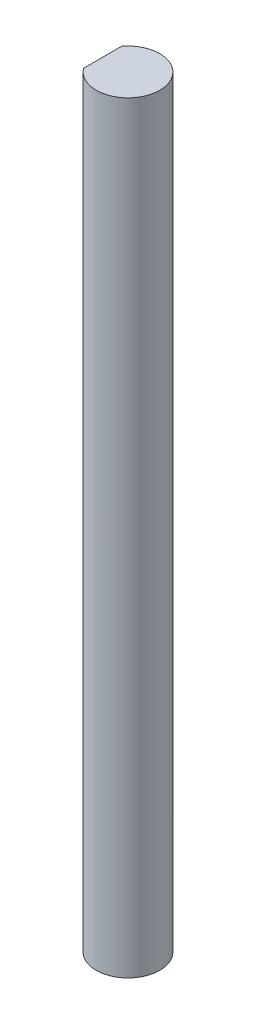
ISO-10303-21;
HEADER;
FILE_DESCRIPTION(('STEP AP214'),'2;1');
FILE_NAME('part.step','',(''),(''),'','','');
FILE_SCHEMA(('AUTOMOTIVE_DESIGN { 1 0 10303 214 1 1 1 1 }'));
ENDSEC;
DATA;
#1=APPLICATION_CONTEXT('core data for automotive mechanical design processes');
#2=APPLICATION_PROTOCOL_DEFINITION('international standard','automotive_design',2000,#1);
#3=PRODUCT_CONTEXT('',#1,'mechanical');
#4=PRODUCT('Part','Part','',(#3));
#5=PRODUCT_RELATED_PRODUCT_CATEGORY('part','',(#4));
#6=PRODUCT_DEFINITION_FORMATION('','',#4);
#7=PRODUCT_DEFINITION_CONTEXT('part definition',#1,'design');
#8=PRODUCT_DEFINITION('design','',#6,#7);
#9=PRODUCT_DEFINITION_SHAPE('','',#8);
#10=(LENGTH_UNIT() NAMED_UNIT(*) SI_UNIT(.MILLI.,.METRE.));
#11=(NAMED_UNIT(*) PLANE_ANGLE_UNIT() SI_UNIT($,.RADIAN.));
#12=(NAMED_UNIT(*) SI_UNIT($,.STERADIAN.) SOLID_ANGLE_UNIT());
#13=UNCERTAINTY_MEASURE_WITH_UNIT(LENGTH_MEASURE(1.E-05),#10,'distance_accuracy_value','');
#14=(GEOMETRIC_REPRESENTATION_CONTEXT(3) GLOBAL_UNCERTAINTY_ASSIGNED_CONTEXT((#13)) GLOBAL_UNIT_ASSIGNED_CONTEXT((#10,
#11,#12)) REPRESENTATION_CONTEXT('',''));
#15=CARTESIAN_POINT('',(0.,0.,0.));
#16=DIRECTION('',(0.,0.,1.));
#17=DIRECTION('',(1.,0.,0.));
#18=AXIS2_PLACEMENT_3D('',#15,#16,#17);
#19=CARTESIAN_POINT('',(0.,30.,0.));
#20=DIRECTION('',(0.,-1.,0.));
#21=DIRECTION('',(0.,0.,-1.));
#22=AXIS2_PLACEMENT_3D('',#19,#20,#21);
#23=CYLINDRICAL_SURFACE('',#22,2.5);
#24=CARTESIAN_POINT('',(0.,30.,0.));
#25=DIRECTION('',(0.,1.,0.));
#26=DIRECTION('',(0.,0.,1.));
#27=AXIS2_PLACEMENT_3D('',#24,#25,#26);
#28=CIRCLE('',#27,2.5);
#29=CARTESIAN_POINT('',(-2.,30.,1.5));
#30=VERTEX_POINT('',#29);
#31=CARTESIAN_POINT('',(-2.,30.,-1.5));
#32=VERTEX_POINT('',#31);
#33=EDGE_CURVE('E11',#30,#32,#28,.T.);
#34=ORIENTED_EDGE('',*,*,#33,.F.);
#35=DIRECTION('',(0.,1.,0.));
#36=VECTOR('',#35,1.);
#37=CARTESIAN_POINT('',(-2.,15.,1.5));
#38=LINE('',#37,#36);
#39=CARTESIAN_POINT('',(-2.,15.,1.5));
#40=VERTEX_POINT('',#39);
#41=EDGE_CURVE('E54',#40,#30,#38,.T.);
#42=ORIENTED_EDGE('',*,*,#41,.F.);
#43=CARTESIAN_POINT('',(0.,15.,0.));
#44=DIRECTION('',(0.,1.,0.));
#45=DIRECTION('',(0.,0.,1.));
#46=AXIS2_PLACEMENT_3D('',#43,#44,#45);
#47=CIRCLE('',#46,2.5);
#48=CARTESIAN_POINT('',(-2.,15.,-1.5));
#49=VERTEX_POINT('',#48);
#50=EDGE_CURVE('E70',#49,#40,#47,.T.);
#51=ORIENTED_EDGE('',*,*,#50,.F.);
#52=DIRECTION('',(0.,1.,0.));
#53=VECTOR('',#52,1.);
#54=CARTESIAN_POINT('',(-2.,15.,-1.5));
#55=LINE('',#54,#53);
#56=EDGE_CURVE('E60',#49,#32,#55,.T.);
#57=ORIENTED_EDGE('',*,*,#56,.T.);
#58=EDGE_LOOP('',(#34,#42,#51,#57));
#59=FACE_BOUND('',#58,.T.);
#60=CARTESIAN_POINT('',(0.,-30.,0.));
#61=DIRECTION('',(0.,1.,0.));
#62=DIRECTION('',(0.,0.,1.));
#63=AXIS2_PLACEMENT_3D('',#60,#61,#62);
#64=CIRCLE('',#63,2.5);
#65=CARTESIAN_POINT('',(0.,-30.,2.5));
#66=VERTEX_POINT('',#65);
#67=EDGE_CURVE('E42',#66,#66,#64,.T.);
#68=ORIENTED_EDGE('',*,*,#67,.T.);
#69=EDGE_LOOP('',(#68));
#70=FACE_BOUND('',#69,.T.);
#71=ADVANCED_FACE('F39',(#59,#70),#23,.T.);
#72=CARTESIAN_POINT('',(0.,30.,0.));
#73=DIRECTION('',(0.,1.,0.));
#74=DIRECTION('',(0.,0.,1.));
#75=AXIS2_PLACEMENT_3D('',#72,#73,#74);
#76=PLANE('',#75);
#77=DIRECTION('',(0.,0.,-1.));
#78=VECTOR('',#77,1.);
#79=CARTESIAN_POINT('',(-2.,30.,1.5));
#80=LINE('',#79,#78);
#81=EDGE_CURVE('E65',#30,#32,#80,.T.);
#82=ORIENTED_EDGE('',*,*,#81,.F.);
#83=ORIENTED_EDGE('',*,*,#33,.T.);
#84=EDGE_LOOP('',(#82,#83));
#85=FACE_BOUND('',#84,.T.);
#86=ADVANCED_FACE('F77',(#85),#76,.T.);
#87=CARTESIAN_POINT('',(0.,-30.,0.));
#88=DIRECTION('',(0.,1.,0.));
#89=DIRECTION('',(0.,0.,1.));
#90=AXIS2_PLACEMENT_3D('',#87,#88,#89);
#91=PLANE('',#90);
#92=ORIENTED_EDGE('',*,*,#67,.F.);
#93=EDGE_LOOP('',(#92));
#94=FACE_BOUND('',#93,.T.);
#95=ADVANCED_FACE('F79',(#94),#91,.F.);
#96=CARTESIAN_POINT('',(-2.,15.,1.5));
#97=DIRECTION('',(1.,0.,0.));
#98=DIRECTION('',(0.,0.,-1.));
#99=AXIS2_PLACEMENT_3D('',#96,#97,#98);
#100=PLANE('',#99);
#101=ORIENTED_EDGE('',*,*,#81,.T.);
#102=ORIENTED_EDGE('',*,*,#56,.F.);
#103=DIRECTION('',(0.,0.,-1.));
#104=VECTOR('',#103,1.);
#105=CARTESIAN_POINT('',(-2.,15.,1.5));
#106=LINE('',#105,#104);
#107=EDGE_CURVE('E94',#40,#49,#106,.T.);
#108=ORIENTED_EDGE('',*,*,#107,.F.);
#109=ORIENTED_EDGE('',*,*,#41,.T.);
#110=EDGE_LOOP('',(#101,#102,#108,#109));
#111=FACE_BOUND('',#110,.T.);
#112=ADVANCED_FACE('F66',(#111),#100,.F.);
#113=CARTESIAN_POINT('',(0.,15.,0.));
#114=DIRECTION('',(0.,1.,0.));
#115=DIRECTION('',(0.,0.,1.));
#116=AXIS2_PLACEMENT_3D('',#113,#114,#115);
#117=PLANE('',#116);
#118=ORIENTED_EDGE('',*,*,#50,.T.);
#119=ORIENTED_EDGE('',*,*,#107,.T.);
#120=EDGE_LOOP('',(#118,#119));
#121=FACE_BOUND('',#120,.T.);
#122=ADVANCED_FACE('F89',(#121),#117,.T.);
#123=CLOSED_SHELL('',(#71,#86,#95,#112,#122));
#124=MANIFOLD_SOLID_BREP('B2',#123);
#125=ADVANCED_BREP_SHAPE_REPRESENTATION('',(#18,#124),#14);
#126=SHAPE_DEFINITION_REPRESENTATION(#9,#125);
ENDSEC;
END-ISO-10303-21;
